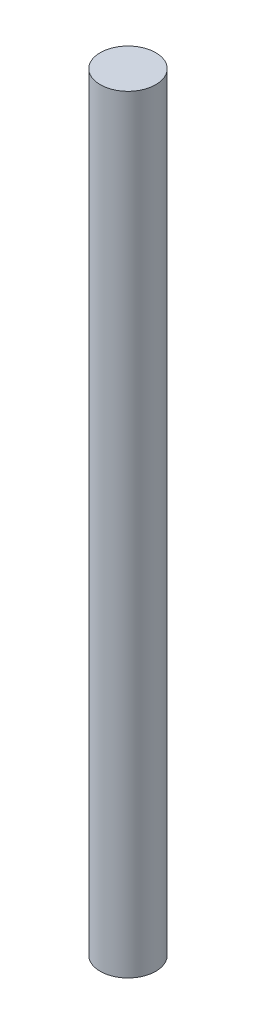
ISO-10303-21;
HEADER;
FILE_DESCRIPTION(('STEP AP214'),'2;1');
FILE_NAME('part.step','',(''),(''),'','','');
FILE_SCHEMA(('AUTOMOTIVE_DESIGN { 1 0 10303 214 1 1 1 1 }'));
ENDSEC;
DATA;
#1=APPLICATION_CONTEXT('core data for automotive mechanical design processes');
#2=APPLICATION_PROTOCOL_DEFINITION('international standard','automotive_design',2000,#1);
#3=PRODUCT_CONTEXT('',#1,'mechanical');
#4=PRODUCT('Part','Part','',(#3));
#5=PRODUCT_RELATED_PRODUCT_CATEGORY('part','',(#4));
#6=PRODUCT_DEFINITION_FORMATION('','',#4);
#7=PRODUCT_DEFINITION_CONTEXT('part definition',#1,'design');
#8=PRODUCT_DEFINITION('design','',#6,#7);
#9=PRODUCT_DEFINITION_SHAPE('','',#8);
#10=(LENGTH_UNIT() NAMED_UNIT(*) SI_UNIT(.MILLI.,.METRE.));
#11=(NAMED_UNIT(*) PLANE_ANGLE_UNIT() SI_UNIT($,.RADIAN.));
#12=(NAMED_UNIT(*) SI_UNIT($,.STERADIAN.) SOLID_ANGLE_UNIT());
#13=UNCERTAINTY_MEASURE_WITH_UNIT(LENGTH_MEASURE(1.E-05),#10,'distance_accuracy_value','');
#14=(GEOMETRIC_REPRESENTATION_CONTEXT(3) GLOBAL_UNCERTAINTY_ASSIGNED_CONTEXT((#13)) GLOBAL_UNIT_ASSIGNED_CONTEXT((#10,
#11,#12)) REPRESENTATION_CONTEXT('',''));
#15=CARTESIAN_POINT('',(0.,0.,0.));
#16=DIRECTION('',(0.,0.,1.));
#17=DIRECTION('',(1.,0.,0.));
#18=AXIS2_PLACEMENT_3D('',#15,#16,#17);
#19=CARTESIAN_POINT('',(0.,41.5,0.));
#20=DIRECTION('',(0.,-1.,0.));
#21=DIRECTION('',(0.,0.,-1.));
#22=AXIS2_PLACEMENT_3D('',#19,#20,#21);
#23=CYLINDRICAL_SURFACE('',#22,1.5);
#24=CARTESIAN_POINT('',(0.,41.5,0.));
#25=DIRECTION('',(0.,1.,0.));
#26=DIRECTION('',(0.,0.,1.));
#27=AXIS2_PLACEMENT_3D('',#24,#25,#26);
#28=CIRCLE('',#27,1.5);
#29=CARTESIAN_POINT('',(0.,41.5,1.5));
#30=VERTEX_POINT('',#29);
#31=EDGE_CURVE('E10',#30,#30,#28,.T.);
#32=ORIENTED_EDGE('',*,*,#31,.F.);
#33=EDGE_LOOP('',(#32));
#34=FACE_BOUND('',#33,.T.);
#35=CARTESIAN_POINT('',(0.,0.,0.));
#36=DIRECTION('',(0.,1.,0.));
#37=DIRECTION('',(0.,0.,1.));
#38=AXIS2_PLACEMENT_3D('',#35,#36,#37);
#39=CIRCLE('',#38,1.5);
#40=CARTESIAN_POINT('',(0.,0.,1.5));
#41=VERTEX_POINT('',#40);
#42=EDGE_CURVE('E40',#41,#41,#39,.T.);
#43=ORIENTED_EDGE('',*,*,#42,.T.);
#44=EDGE_LOOP('',(#43));
#45=FACE_BOUND('',#44,.T.);
#46=ADVANCED_FACE('F37',(#34,#45),#23,.T.);
#47=CARTESIAN_POINT('',(0.,41.5,0.));
#48=DIRECTION('',(0.,1.,0.));
#49=DIRECTION('',(0.,0.,1.));
#50=AXIS2_PLACEMENT_3D('',#47,#48,#49);
#51=PLANE('',#50);
#52=ORIENTED_EDGE('',*,*,#31,.T.);
#53=EDGE_LOOP('',(#52));
#54=FACE_BOUND('',#53,.T.);
#55=ADVANCED_FACE('F52',(#54),#51,.T.);
#56=CARTESIAN_POINT('',(0.,0.,0.));
#57=DIRECTION('',(0.,1.,0.));
#58=DIRECTION('',(0.,0.,1.));
#59=AXIS2_PLACEMENT_3D('',#56,#57,#58);
#60=PLANE('',#59);
#61=ORIENTED_EDGE('',*,*,#42,.F.);
#62=EDGE_LOOP('',(#61));
#63=FACE_BOUND('',#62,.T.);
#64=ADVANCED_FACE('F50',(#63),#60,.F.);
#65=CLOSED_SHELL('',(#46,#55,#64));
#66=MANIFOLD_SOLID_BREP('B2',#65);
#67=ADVANCED_BREP_SHAPE_REPRESENTATION('',(#18,#66),#14);
#68=SHAPE_DEFINITION_REPRESENTATION(#9,#67);
ENDSEC;
END-ISO-10303-21;
